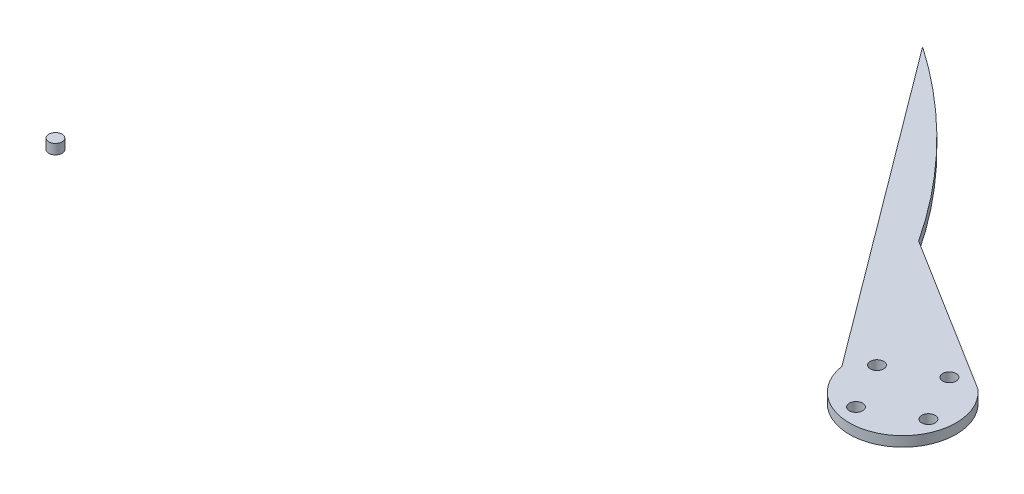
ISO-10303-21;
HEADER;
FILE_DESCRIPTION(('STEP AP214'),'2;1');
FILE_NAME('part.step','',(''),(''),'','','');
FILE_SCHEMA(('AUTOMOTIVE_DESIGN { 1 0 10303 214 1 1 1 1 }'));
ENDSEC;
DATA;
#1=APPLICATION_CONTEXT('core data for automotive mechanical design processes');
#2=APPLICATION_PROTOCOL_DEFINITION('international standard','automotive_design',2000,#1);
#3=PRODUCT_CONTEXT('',#1,'mechanical');
#4=PRODUCT('Part','Part','',(#3));
#5=PRODUCT_RELATED_PRODUCT_CATEGORY('part','',(#4));
#6=PRODUCT_DEFINITION_FORMATION('','',#4);
#7=PRODUCT_DEFINITION_CONTEXT('part definition',#1,'design');
#8=PRODUCT_DEFINITION('design','',#6,#7);
#9=PRODUCT_DEFINITION_SHAPE('','',#8);
#10=(LENGTH_UNIT() NAMED_UNIT(*) SI_UNIT(.MILLI.,.METRE.));
#11=(NAMED_UNIT(*) PLANE_ANGLE_UNIT() SI_UNIT($,.RADIAN.));
#12=(NAMED_UNIT(*) SI_UNIT($,.STERADIAN.) SOLID_ANGLE_UNIT());
#13=UNCERTAINTY_MEASURE_WITH_UNIT(LENGTH_MEASURE(1.E-05),#10,'distance_accuracy_value','');
#14=(GEOMETRIC_REPRESENTATION_CONTEXT(3) GLOBAL_UNCERTAINTY_ASSIGNED_CONTEXT((#13)) GLOBAL_UNIT_ASSIGNED_CONTEXT((#10,
#11,#12)) REPRESENTATION_CONTEXT('',''));
#15=CARTESIAN_POINT('',(0.,0.,0.));
#16=DIRECTION('',(0.,0.,1.));
#17=DIRECTION('',(1.,0.,0.));
#18=AXIS2_PLACEMENT_3D('',#15,#16,#17);
#19=CARTESIAN_POINT('',(-94.6788013152589,3.,-49.5));
#20=DIRECTION('',(0.,-1.,0.));
#21=DIRECTION('',(0.,0.,-1.));
#22=AXIS2_PLACEMENT_3D('',#19,#20,#21);
#23=CYLINDRICAL_SURFACE('',#22,2.);
#24=CARTESIAN_POINT('',(-94.6788013152589,3.,-49.5));
#25=DIRECTION('',(0.,1.,0.));
#26=DIRECTION('',(0.,0.,1.));
#27=AXIS2_PLACEMENT_3D('',#24,#25,#26);
#28=CIRCLE('',#27,2.);
#29=CARTESIAN_POINT('',(-94.6788013152589,3.,-47.5));
#30=VERTEX_POINT('',#29);
#31=EDGE_CURVE('E53',#30,#30,#28,.T.);
#32=ORIENTED_EDGE('',*,*,#31,.F.);
#33=EDGE_LOOP('',(#32));
#34=FACE_BOUND('',#33,.T.);
#35=CARTESIAN_POINT('',(-94.6788013152589,0.,-49.5));
#36=DIRECTION('',(0.,1.,0.));
#37=DIRECTION('',(0.,0.,1.));
#38=AXIS2_PLACEMENT_3D('',#35,#36,#37);
#39=CIRCLE('',#38,2.);
#40=CARTESIAN_POINT('',(-94.6788013152589,0.,-47.5));
#41=VERTEX_POINT('',#40);
#42=EDGE_CURVE('E11',#41,#41,#39,.T.);
#43=ORIENTED_EDGE('',*,*,#42,.T.);
#44=EDGE_LOOP('',(#43));
#45=FACE_BOUND('',#44,.T.);
#46=ADVANCED_FACE('F49',(#34,#45),#23,.T.);
#47=CARTESIAN_POINT('',(-94.6788013152589,3.,-49.5));
#48=DIRECTION('',(0.,1.,0.));
#49=DIRECTION('',(0.,0.,1.));
#50=AXIS2_PLACEMENT_3D('',#47,#48,#49);
#51=PLANE('',#50);
#52=ORIENTED_EDGE('',*,*,#31,.T.);
#53=EDGE_LOOP('',(#52));
#54=FACE_BOUND('',#53,.T.);
#55=ADVANCED_FACE('F51',(#54),#51,.T.);
#56=CARTESIAN_POINT('',(-94.6788013152589,0.,-49.5));
#57=DIRECTION('',(0.,1.,0.));
#58=DIRECTION('',(0.,0.,1.));
#59=AXIS2_PLACEMENT_3D('',#56,#57,#58);
#60=PLANE('',#59);
#61=ORIENTED_EDGE('',*,*,#42,.F.);
#62=EDGE_LOOP('',(#61));
#63=FACE_BOUND('',#62,.T.);
#64=ADVANCED_FACE('F68',(#63),#60,.F.);
#65=CLOSED_SHELL('',(#46,#55,#64));
#66=MANIFOLD_SOLID_BREP('B2',#65);
#67=CARTESIAN_POINT('',(98.4566003513387,3.,-110.571287113325));
#68=DIRECTION('',(0.,1.,0.));
#69=DIRECTION('',(0.,0.,1.));
#70=AXIS2_PLACEMENT_3D('',#67,#68,#69);
#71=PLANE('',#70);
#72=CARTESIAN_POINT('',(95.3016302380107,3.,-99.7063819787178));
#73=DIRECTION('',(0.,1.,0.));
#74=DIRECTION('',(0.,0.,1.));
#75=AXIS2_PLACEMENT_3D('',#72,#73,#74);
#76=CIRCLE('',#75,2.);
#77=CARTESIAN_POINT('',(95.3016302380107,3.,-97.7063819787178));
#78=VERTEX_POINT('',#77);
#79=EDGE_CURVE('E178',#78,#78,#76,.T.);
#80=ORIENTED_EDGE('',*,*,#79,.F.);
#81=EDGE_LOOP('',(#80));
#82=FACE_BOUND('',#81,.T.);
#83=CARTESIAN_POINT('',(101.611570464667,3.,-121.436192247932));
#84=DIRECTION('',(0.,1.,0.));
#85=DIRECTION('',(0.,0.,1.));
#86=AXIS2_PLACEMENT_3D('',#83,#84,#85);
#87=CIRCLE('',#86,1.99999999999995);
#88=CARTESIAN_POINT('',(101.611570464667,3.,-119.436192247932));
#89=VERTEX_POINT('',#88);
#90=EDGE_CURVE('E157',#89,#89,#87,.T.);
#91=ORIENTED_EDGE('',*,*,#90,.F.);
#92=EDGE_LOOP('',(#91));
#93=FACE_BOUND('',#92,.T.);
#94=CARTESIAN_POINT('',(98.4566003513387,3.,-110.571287113325));
#95=DIRECTION('',(0.,1.,0.));
#96=DIRECTION('',(0.,0.,1.));
#97=AXIS2_PLACEMENT_3D('',#94,#95,#96);
#98=CIRCLE('',#97,16.);
#99=CARTESIAN_POINT('',(82.6430977195357,3.,-108.135484470671));
#100=VERTEX_POINT('',#99);
#101=CARTESIAN_POINT('',(108.983290397122,3.,-122.620718497419));
#102=VERTEX_POINT('',#101);
#103=EDGE_CURVE('E142',#100,#102,#98,.T.);
#104=ORIENTED_EDGE('',*,*,#103,.T.);
#105=DIRECTION('',(-0.848183698013594,0.,-0.529702194090212));
#106=VECTOR('',#105,1.);
#107=CARTESIAN_POINT('',(108.983290397122,3.,-122.620718497419));
#108=LINE('',#107,#106);
#109=CARTESIAN_POINT('',(61.5790229217912,3.,-152.225324845937));
#110=VERTEX_POINT('',#109);
#111=EDGE_CURVE('E137',#102,#110,#108,.T.);
#112=ORIENTED_EDGE('',*,*,#111,.T.);
#113=CARTESIAN_POINT('',(-94.6788013152589,3.,-49.5));
#114=DIRECTION('',(0.,1.,0.));
#115=DIRECTION('',(0.,0.,1.));
#116=AXIS2_PLACEMENT_3D('',#113,#114,#115);
#117=CIRCLE('',#116,187.);
#118=CARTESIAN_POINT('',(11.7193464689893,3.,-203.280473884305));
#119=VERTEX_POINT('',#118);
#120=EDGE_CURVE('E140',#110,#119,#117,.T.);
#121=ORIENTED_EDGE('',*,*,#120,.T.);
#122=DIRECTION('',(0.597651483189652,0.,0.801756013161865));
#123=VECTOR('',#122,1.);
#124=CARTESIAN_POINT('',(82.6430977195357,3.,-108.135484470671));
#125=LINE('',#124,#123);
#126=EDGE_CURVE('E107',#119,#100,#125,.T.);
#127=ORIENTED_EDGE('',*,*,#126,.T.);
#128=EDGE_LOOP('',(#104,#112,#121,#127));
#129=FACE_BOUND('',#128,.T.);
#130=CARTESIAN_POINT('',(109.321505485946,3.,-107.416316999997));
#131=DIRECTION('',(0.,1.,0.));
#132=DIRECTION('',(0.,0.,1.));
#133=AXIS2_PLACEMENT_3D('',#130,#131,#132);
#134=CIRCLE('',#133,1.99999999999997);
#135=CARTESIAN_POINT('',(109.321505485946,3.,-105.416316999997));
#136=VERTEX_POINT('',#135);
#137=EDGE_CURVE('E172',#136,#136,#134,.T.);
#138=ORIENTED_EDGE('',*,*,#137,.F.);
#139=EDGE_LOOP('',(#138));
#140=FACE_BOUND('',#139,.T.);
#141=CARTESIAN_POINT('',(87.5916952167318,3.,-113.726257226653));
#142=DIRECTION('',(0.,1.,0.));
#143=DIRECTION('',(0.,0.,1.));
#144=AXIS2_PLACEMENT_3D('',#141,#142,#143);
#145=CIRCLE('',#144,1.99999999999997);
#146=CARTESIAN_POINT('',(87.5916952167318,3.,-111.726257226653));
#147=VERTEX_POINT('',#146);
#148=EDGE_CURVE('E184',#147,#147,#145,.T.);
#149=ORIENTED_EDGE('',*,*,#148,.F.);
#150=EDGE_LOOP('',(#149));
#151=FACE_BOUND('',#150,.T.);
#152=ADVANCED_FACE('F90',(#82,#93,#129,#140,#151),#71,.T.);
#153=CARTESIAN_POINT('',(98.4566003513387,0.,-110.571287113325));
#154=DIRECTION('',(0.,1.,0.));
#155=DIRECTION('',(0.,0.,1.));
#156=AXIS2_PLACEMENT_3D('',#153,#154,#155);
#157=PLANE('',#156);
#158=CARTESIAN_POINT('',(98.4566003513387,0.,-110.571287113325));
#159=DIRECTION('',(0.,1.,0.));
#160=DIRECTION('',(0.,0.,1.));
#161=AXIS2_PLACEMENT_3D('',#158,#159,#160);
#162=CIRCLE('',#161,16.);
#163=CARTESIAN_POINT('',(82.6430977195357,0.,-108.135484470671));
#164=VERTEX_POINT('',#163);
#165=CARTESIAN_POINT('',(108.983290397122,0.,-122.620718497419));
#166=VERTEX_POINT('',#165);
#167=EDGE_CURVE('E154',#164,#166,#162,.T.);
#168=ORIENTED_EDGE('',*,*,#167,.F.);
#169=DIRECTION('',(0.597651483189652,0.,0.801756013161865));
#170=VECTOR('',#169,1.);
#171=CARTESIAN_POINT('',(82.6430977195357,0.,-108.135484470671));
#172=LINE('',#171,#170);
#173=CARTESIAN_POINT('',(11.7193464689893,0.,-203.280473884305));
#174=VERTEX_POINT('',#173);
#175=EDGE_CURVE('E130',#174,#164,#172,.T.);
#176=ORIENTED_EDGE('',*,*,#175,.F.);
#177=CARTESIAN_POINT('',(-94.6788013152589,0.,-49.5));
#178=DIRECTION('',(0.,1.,0.));
#179=DIRECTION('',(0.,0.,1.));
#180=AXIS2_PLACEMENT_3D('',#177,#178,#179);
#181=CIRCLE('',#180,187.);
#182=CARTESIAN_POINT('',(61.5790229217912,0.,-152.225324845937));
#183=VERTEX_POINT('',#182);
#184=EDGE_CURVE('E124',#183,#174,#181,.T.);
#185=ORIENTED_EDGE('',*,*,#184,.F.);
#186=DIRECTION('',(-0.848183698013594,0.,-0.529702194090212));
#187=VECTOR('',#186,1.);
#188=CARTESIAN_POINT('',(108.983290397122,0.,-122.620718497419));
#189=LINE('',#188,#187);
#190=EDGE_CURVE('E146',#166,#183,#189,.T.);
#191=ORIENTED_EDGE('',*,*,#190,.F.);
#192=EDGE_LOOP('',(#168,#176,#185,#191));
#193=FACE_BOUND('',#192,.T.);
#194=CARTESIAN_POINT('',(101.611570464667,0.,-121.436192247932));
#195=DIRECTION('',(0.,1.,0.));
#196=DIRECTION('',(0.,0.,1.));
#197=AXIS2_PLACEMENT_3D('',#194,#195,#196);
#198=CIRCLE('',#197,1.99999999999995);
#199=CARTESIAN_POINT('',(101.611570464667,0.,-119.436192247932));
#200=VERTEX_POINT('',#199);
#201=EDGE_CURVE('E169',#200,#200,#198,.T.);
#202=ORIENTED_EDGE('',*,*,#201,.T.);
#203=EDGE_LOOP('',(#202));
#204=FACE_BOUND('',#203,.T.);
#205=CARTESIAN_POINT('',(109.321505485946,0.,-107.416316999997));
#206=DIRECTION('',(0.,1.,0.));
#207=DIRECTION('',(0.,0.,1.));
#208=AXIS2_PLACEMENT_3D('',#205,#206,#207);
#209=CIRCLE('',#208,1.99999999999997);
#210=CARTESIAN_POINT('',(109.321505485946,0.,-105.416316999997));
#211=VERTEX_POINT('',#210);
#212=EDGE_CURVE('E175',#211,#211,#209,.T.);
#213=ORIENTED_EDGE('',*,*,#212,.T.);
#214=EDGE_LOOP('',(#213));
#215=FACE_BOUND('',#214,.T.);
#216=CARTESIAN_POINT('',(95.3016302380107,0.,-99.7063819787178));
#217=DIRECTION('',(0.,1.,0.));
#218=DIRECTION('',(0.,0.,1.));
#219=AXIS2_PLACEMENT_3D('',#216,#217,#218);
#220=CIRCLE('',#219,2.);
#221=CARTESIAN_POINT('',(95.3016302380107,0.,-97.7063819787178));
#222=VERTEX_POINT('',#221);
#223=EDGE_CURVE('E181',#222,#222,#220,.T.);
#224=ORIENTED_EDGE('',*,*,#223,.T.);
#225=EDGE_LOOP('',(#224));
#226=FACE_BOUND('',#225,.T.);
#227=CARTESIAN_POINT('',(87.5916952167318,0.,-113.726257226653));
#228=DIRECTION('',(0.,1.,0.));
#229=DIRECTION('',(0.,0.,1.));
#230=AXIS2_PLACEMENT_3D('',#227,#228,#229);
#231=CIRCLE('',#230,1.99999999999997);
#232=CARTESIAN_POINT('',(87.5916952167318,0.,-111.726257226653));
#233=VERTEX_POINT('',#232);
#234=EDGE_CURVE('E187',#233,#233,#231,.T.);
#235=ORIENTED_EDGE('',*,*,#234,.T.);
#236=EDGE_LOOP('',(#235));
#237=FACE_BOUND('',#236,.T.);
#238=ADVANCED_FACE('F165',(#193,#204,#215,#226,#237),#157,.F.);
#239=CARTESIAN_POINT('',(98.4566003513387,3.,-110.571287113325));
#240=DIRECTION('',(0.,-1.,0.));
#241=DIRECTION('',(0.,0.,-1.));
#242=AXIS2_PLACEMENT_3D('',#239,#240,#241);
#243=CYLINDRICAL_SURFACE('',#242,16.);
#244=ORIENTED_EDGE('',*,*,#167,.T.);
#245=DIRECTION('',(0.,-1.,0.));
#246=VECTOR('',#245,1.);
#247=CARTESIAN_POINT('',(108.983290397122,3.,-122.620718497419));
#248=LINE('',#247,#246);
#249=EDGE_CURVE('E47',#102,#166,#248,.T.);
#250=ORIENTED_EDGE('',*,*,#249,.F.);
#251=ORIENTED_EDGE('',*,*,#103,.F.);
#252=DIRECTION('',(0.,-1.,0.));
#253=VECTOR('',#252,1.);
#254=CARTESIAN_POINT('',(82.6430977195357,3.,-108.135484470671));
#255=LINE('',#254,#253);
#256=EDGE_CURVE('E150',#100,#164,#255,.T.);
#257=ORIENTED_EDGE('',*,*,#256,.T.);
#258=EDGE_LOOP('',(#244,#250,#251,#257));
#259=FACE_BOUND('',#258,.T.);
#260=ADVANCED_FACE('F92',(#259),#243,.T.);
#261=CARTESIAN_POINT('',(108.983290397122,3.,-122.620718497419));
#262=DIRECTION('',(-0.529702194090212,0.,0.848183698013594));
#263=DIRECTION('',(0.848183698013594,0.,0.529702194090212));
#264=AXIS2_PLACEMENT_3D('',#261,#262,#263);
#265=PLANE('',#264);
#266=ORIENTED_EDGE('',*,*,#190,.T.);
#267=DIRECTION('',(0.,-1.,0.));
#268=VECTOR('',#267,1.);
#269=CARTESIAN_POINT('',(61.5790229217912,3.,-152.225324845937));
#270=LINE('',#269,#268);
#271=EDGE_CURVE('E99',#110,#183,#270,.T.);
#272=ORIENTED_EDGE('',*,*,#271,.F.);
#273=ORIENTED_EDGE('',*,*,#111,.F.);
#274=ORIENTED_EDGE('',*,*,#249,.T.);
#275=EDGE_LOOP('',(#266,#272,#273,#274));
#276=FACE_BOUND('',#275,.T.);
#277=ADVANCED_FACE('F145',(#276),#265,.F.);
#278=CARTESIAN_POINT('',(-94.6788013152589,3.,-49.5));
#279=DIRECTION('',(0.,-1.,0.));
#280=DIRECTION('',(0.,0.,-1.));
#281=AXIS2_PLACEMENT_3D('',#278,#279,#280);
#282=CYLINDRICAL_SURFACE('',#281,187.);
#283=ORIENTED_EDGE('',*,*,#184,.T.);
#284=DIRECTION('',(0.,-1.,0.));
#285=VECTOR('',#284,1.);
#286=CARTESIAN_POINT('',(11.7193464689893,3.,-203.280473884305));
#287=LINE('',#286,#285);
#288=EDGE_CURVE('E147',#119,#174,#287,.T.);
#289=ORIENTED_EDGE('',*,*,#288,.F.);
#290=ORIENTED_EDGE('',*,*,#120,.F.);
#291=ORIENTED_EDGE('',*,*,#271,.T.);
#292=EDGE_LOOP('',(#283,#289,#290,#291));
#293=FACE_BOUND('',#292,.T.);
#294=ADVANCED_FACE('F148',(#293),#282,.T.);
#295=CARTESIAN_POINT('',(82.6430977195357,3.,-108.135484470671));
#296=DIRECTION('',(0.801756013161866,0.,-0.597651483189652));
#297=DIRECTION('',(-0.597651483189652,0.,-0.801756013161866));
#298=AXIS2_PLACEMENT_3D('',#295,#296,#297);
#299=PLANE('',#298);
#300=ORIENTED_EDGE('',*,*,#175,.T.);
#301=ORIENTED_EDGE('',*,*,#256,.F.);
#302=ORIENTED_EDGE('',*,*,#126,.F.);
#303=ORIENTED_EDGE('',*,*,#288,.T.);
#304=EDGE_LOOP('',(#300,#301,#302,#303));
#305=FACE_BOUND('',#304,.T.);
#306=ADVANCED_FACE('F162',(#305),#299,.F.);
#307=CARTESIAN_POINT('',(101.611570464667,3.,-121.436192247932));
#308=DIRECTION('',(0.,-1.,0.));
#309=DIRECTION('',(0.,0.,-1.));
#310=AXIS2_PLACEMENT_3D('',#307,#308,#309);
#311=CYLINDRICAL_SURFACE('',#310,1.99999999999995);
#312=ORIENTED_EDGE('',*,*,#90,.T.);
#313=EDGE_LOOP('',(#312));
#314=FACE_BOUND('',#313,.T.);
#315=ORIENTED_EDGE('',*,*,#201,.F.);
#316=EDGE_LOOP('',(#315));
#317=FACE_BOUND('',#316,.T.);
#318=ADVANCED_FACE('F206',(#314,#317),#311,.F.);
#319=CARTESIAN_POINT('',(109.321505485946,3.,-107.416316999997));
#320=DIRECTION('',(0.,-1.,0.));
#321=DIRECTION('',(0.,0.,-1.));
#322=AXIS2_PLACEMENT_3D('',#319,#320,#321);
#323=CYLINDRICAL_SURFACE('',#322,1.99999999999997);
#324=ORIENTED_EDGE('',*,*,#137,.T.);
#325=EDGE_LOOP('',(#324));
#326=FACE_BOUND('',#325,.T.);
#327=ORIENTED_EDGE('',*,*,#212,.F.);
#328=EDGE_LOOP('',(#327));
#329=FACE_BOUND('',#328,.T.);
#330=ADVANCED_FACE('F251',(#326,#329),#323,.F.);
#331=CARTESIAN_POINT('',(95.3016302380107,3.,-99.7063819787178));
#332=DIRECTION('',(0.,-1.,0.));
#333=DIRECTION('',(0.,0.,-1.));
#334=AXIS2_PLACEMENT_3D('',#331,#332,#333);
#335=CYLINDRICAL_SURFACE('',#334,2.);
#336=ORIENTED_EDGE('',*,*,#79,.T.);
#337=EDGE_LOOP('',(#336));
#338=FACE_BOUND('',#337,.T.);
#339=ORIENTED_EDGE('',*,*,#223,.F.);
#340=EDGE_LOOP('',(#339));
#341=FACE_BOUND('',#340,.T.);
#342=ADVANCED_FACE('F259',(#338,#341),#335,.F.);
#343=CARTESIAN_POINT('',(87.5916952167318,3.,-113.726257226653));
#344=DIRECTION('',(0.,-1.,0.));
#345=DIRECTION('',(0.,0.,-1.));
#346=AXIS2_PLACEMENT_3D('',#343,#344,#345);
#347=CYLINDRICAL_SURFACE('',#346,1.99999999999997);
#348=ORIENTED_EDGE('',*,*,#148,.T.);
#349=EDGE_LOOP('',(#348));
#350=FACE_BOUND('',#349,.T.);
#351=ORIENTED_EDGE('',*,*,#234,.F.);
#352=EDGE_LOOP('',(#351));
#353=FACE_BOUND('',#352,.T.);
#354=ADVANCED_FACE('F193',(#350,#353),#347,.F.);
#355=CLOSED_SHELL('',(#152,#238,#260,#277,#294,#306,#318,#330,#342,#354));
#356=MANIFOLD_SOLID_BREP('B6',#355);
#357=ADVANCED_BREP_SHAPE_REPRESENTATION('',(#18,#66,#356),#14);
#358=SHAPE_DEFINITION_REPRESENTATION(#9,#357);
ENDSEC;
END-ISO-10303-21;
